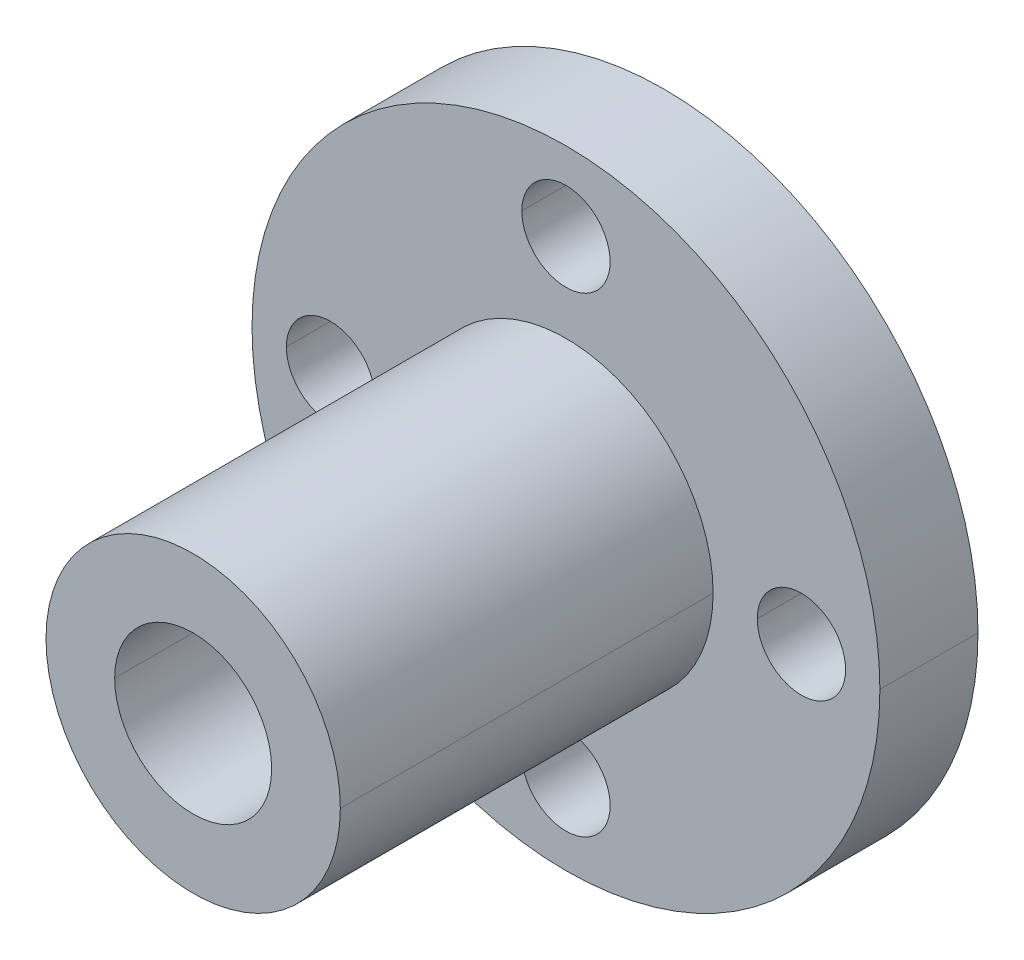
ISO-10303-21;
HEADER;
FILE_DESCRIPTION(('STEP AP214'),'2;1');
FILE_NAME('part.step','',(''),(''),'','','');
FILE_SCHEMA(('AUTOMOTIVE_DESIGN { 1 0 10303 214 1 1 1 1 }'));
ENDSEC;
DATA;
#1=APPLICATION_CONTEXT('core data for automotive mechanical design processes');
#2=APPLICATION_PROTOCOL_DEFINITION('international standard','automotive_design',2000,#1);
#3=PRODUCT_CONTEXT('',#1,'mechanical');
#4=PRODUCT('Part','Part','',(#3));
#5=PRODUCT_RELATED_PRODUCT_CATEGORY('part','',(#4));
#6=PRODUCT_DEFINITION_FORMATION('','',#4);
#7=PRODUCT_DEFINITION_CONTEXT('part definition',#1,'design');
#8=PRODUCT_DEFINITION('design','',#6,#7);
#9=PRODUCT_DEFINITION_SHAPE('','',#8);
#10=(LENGTH_UNIT() NAMED_UNIT(*) SI_UNIT(.MILLI.,.METRE.));
#11=(NAMED_UNIT(*) PLANE_ANGLE_UNIT() SI_UNIT($,.RADIAN.));
#12=(NAMED_UNIT(*) SI_UNIT($,.STERADIAN.) SOLID_ANGLE_UNIT());
#13=UNCERTAINTY_MEASURE_WITH_UNIT(LENGTH_MEASURE(1.E-05),#10,'distance_accuracy_value','');
#14=(GEOMETRIC_REPRESENTATION_CONTEXT(3) GLOBAL_UNCERTAINTY_ASSIGNED_CONTEXT((#13)) GLOBAL_UNIT_ASSIGNED_CONTEXT((#10,
#11,#12)) REPRESENTATION_CONTEXT('',''));
#15=CARTESIAN_POINT('',(0.,0.,0.));
#16=DIRECTION('',(0.,0.,1.));
#17=DIRECTION('',(1.,0.,0.));
#18=AXIS2_PLACEMENT_3D('',#15,#16,#17);
#19=CARTESIAN_POINT('',(11.9999999999992,-8.15320033709099E-13,5.));
#20=DIRECTION('',(0.,0.,-1.));
#21=DIRECTION('',(-1.,0.,0.));
#22=AXIS2_PLACEMENT_3D('',#19,#20,#21);
#23=CYLINDRICAL_SURFACE('',#22,2.25000000000115);
#24=CARTESIAN_POINT('',(11.9999999999992,-8.15320033709099E-13,5.));
#25=DIRECTION('',(0.,0.,-1.));
#26=DIRECTION('',(-1.,0.,0.));
#27=AXIS2_PLACEMENT_3D('',#24,#25,#26);
#28=CIRCLE('',#27,2.25000000000115);
#29=CARTESIAN_POINT('',(14.2500000000003,-8.15044488179291E-13,5.));
#30=VERTEX_POINT('',#29);
#31=CARTESIAN_POINT('',(9.74999999999803,-8.15320033709099E-13,5.));
#32=VERTEX_POINT('',#31);
#33=EDGE_CURVE('E42',#30,#32,#28,.T.);
#34=ORIENTED_EDGE('',*,*,#33,.F.);
#35=DIRECTION('',(0.,0.,-1.));
#36=VECTOR('',#35,1.);
#37=CARTESIAN_POINT('',(14.2500000000003,-8.15044488179291E-13,5.));
#38=LINE('',#37,#36);
#39=CARTESIAN_POINT('',(14.2500000000003,-8.15044488179291E-13,0.));
#40=VERTEX_POINT('',#39);
#41=EDGE_CURVE('E11',#30,#40,#38,.T.);
#42=ORIENTED_EDGE('',*,*,#41,.T.);
#43=CARTESIAN_POINT('',(11.9999999999992,-8.15320033709099E-13,0.));
#44=DIRECTION('',(0.,0.,-1.));
#45=DIRECTION('',(-1.,0.,0.));
#46=AXIS2_PLACEMENT_3D('',#43,#44,#45);
#47=CIRCLE('',#46,2.25000000000115);
#48=CARTESIAN_POINT('',(9.74999999999803,-8.15320033709099E-13,0.));
#49=VERTEX_POINT('',#48);
#50=EDGE_CURVE('E28',#40,#49,#47,.T.);
#51=ORIENTED_EDGE('',*,*,#50,.T.);
#52=DIRECTION('',(0.,0.,-1.));
#53=VECTOR('',#52,1.);
#54=CARTESIAN_POINT('',(9.74999999999803,-8.15320033709099E-13,5.));
#55=LINE('',#54,#53);
#56=EDGE_CURVE('E204',#32,#49,#55,.T.);
#57=ORIENTED_EDGE('',*,*,#56,.F.);
#58=EDGE_LOOP('',(#34,#42,#51,#57));
#59=FACE_BOUND('',#58,.T.);
#60=ADVANCED_FACE('F17',(#59),#23,.F.);
#61=CARTESIAN_POINT('',(-1.62650951484664E-12,-12.,5.));
#62=DIRECTION('',(0.,0.,-1.));
#63=DIRECTION('',(-1.,0.,0.));
#64=AXIS2_PLACEMENT_3D('',#61,#62,#63);
#65=CYLINDRICAL_SURFACE('',#64,2.25000000000115);
#66=CARTESIAN_POINT('',(-1.62650951484664E-12,-12.,5.));
#67=DIRECTION('',(0.,0.,-1.));
#68=DIRECTION('',(-1.,0.,0.));
#69=AXIS2_PLACEMENT_3D('',#66,#67,#68);
#70=CIRCLE('',#69,2.25000000000115);
#71=CARTESIAN_POINT('',(2.24999999999952,-12.,5.));
#72=VERTEX_POINT('',#71);
#73=CARTESIAN_POINT('',(-2.25000000000278,-12.,5.));
#74=VERTEX_POINT('',#73);
#75=EDGE_CURVE('E202',#72,#74,#70,.T.);
#76=ORIENTED_EDGE('',*,*,#75,.F.);
#77=DIRECTION('',(0.,0.,-1.));
#78=VECTOR('',#77,1.);
#79=CARTESIAN_POINT('',(2.24999999999952,-12.,5.));
#80=LINE('',#79,#78);
#81=CARTESIAN_POINT('',(2.24999999999952,-12.,0.));
#82=VERTEX_POINT('',#81);
#83=EDGE_CURVE('E212',#72,#82,#80,.T.);
#84=ORIENTED_EDGE('',*,*,#83,.T.);
#85=CARTESIAN_POINT('',(-1.62650951484664E-12,-12.,0.));
#86=DIRECTION('',(0.,0.,-1.));
#87=DIRECTION('',(-1.,0.,0.));
#88=AXIS2_PLACEMENT_3D('',#85,#86,#87);
#89=CIRCLE('',#88,2.25000000000115);
#90=CARTESIAN_POINT('',(-2.25000000000278,-12.,0.));
#91=VERTEX_POINT('',#90);
#92=EDGE_CURVE('E192',#82,#91,#89,.T.);
#93=ORIENTED_EDGE('',*,*,#92,.T.);
#94=DIRECTION('',(0.,0.,-1.));
#95=VECTOR('',#94,1.);
#96=CARTESIAN_POINT('',(-2.25000000000278,-12.,5.));
#97=LINE('',#96,#95);
#98=EDGE_CURVE('E21',#74,#91,#97,.T.);
#99=ORIENTED_EDGE('',*,*,#98,.F.);
#100=EDGE_LOOP('',(#76,#84,#93,#99));
#101=FACE_BOUND('',#100,.T.);
#102=ADVANCED_FACE('F351',(#101),#65,.F.);
#103=CARTESIAN_POINT('',(-12.0000000000008,8.13585310233123E-13,5.));
#104=DIRECTION('',(0.,0.,-1.));
#105=DIRECTION('',(-1.,0.,0.));
#106=AXIS2_PLACEMENT_3D('',#103,#104,#105);
#107=CYLINDRICAL_SURFACE('',#106,2.25000000000115);
#108=CARTESIAN_POINT('',(-12.0000000000008,8.13585310233123E-13,5.));
#109=DIRECTION('',(0.,0.,-1.));
#110=DIRECTION('',(-1.,0.,0.));
#111=AXIS2_PLACEMENT_3D('',#108,#109,#110);
#112=CIRCLE('',#111,2.25000000000115);
#113=CARTESIAN_POINT('',(-9.74999999999966,8.13860855762931E-13,5.));
#114=VERTEX_POINT('',#113);
#115=CARTESIAN_POINT('',(-14.250000000002,8.13585310233123E-13,5.));
#116=VERTEX_POINT('',#115);
#117=EDGE_CURVE('E203',#114,#116,#112,.T.);
#118=ORIENTED_EDGE('',*,*,#117,.F.);
#119=DIRECTION('',(0.,0.,-1.));
#120=VECTOR('',#119,1.);
#121=CARTESIAN_POINT('',(-9.74999999999966,8.13860855762931E-13,5.));
#122=LINE('',#121,#120);
#123=CARTESIAN_POINT('',(-9.74999999999966,8.13860855762931E-13,0.));
#124=VERTEX_POINT('',#123);
#125=EDGE_CURVE('E189',#114,#124,#122,.T.);
#126=ORIENTED_EDGE('',*,*,#125,.T.);
#127=CARTESIAN_POINT('',(-12.0000000000008,8.13585310233123E-13,0.));
#128=DIRECTION('',(0.,0.,-1.));
#129=DIRECTION('',(-1.,0.,0.));
#130=AXIS2_PLACEMENT_3D('',#127,#128,#129);
#131=CIRCLE('',#130,2.25000000000115);
#132=CARTESIAN_POINT('',(-14.250000000002,8.13585310233123E-13,0.));
#133=VERTEX_POINT('',#132);
#134=EDGE_CURVE('E193',#124,#133,#131,.T.);
#135=ORIENTED_EDGE('',*,*,#134,.T.);
#136=DIRECTION('',(0.,0.,-1.));
#137=VECTOR('',#136,1.);
#138=CARTESIAN_POINT('',(-14.250000000002,8.13585310233123E-13,5.));
#139=LINE('',#138,#137);
#140=EDGE_CURVE('E251',#116,#133,#139,.T.);
#141=ORIENTED_EDGE('',*,*,#140,.F.);
#142=EDGE_LOOP('',(#118,#126,#135,#141));
#143=FACE_BOUND('',#142,.T.);
#144=ADVANCED_FACE('F343',(#143),#107,.F.);
#145=CARTESIAN_POINT('',(0.,12.,5.));
#146=DIRECTION('',(0.,0.,-1.));
#147=DIRECTION('',(-1.,0.,0.));
#148=AXIS2_PLACEMENT_3D('',#145,#146,#147);
#149=CYLINDRICAL_SURFACE('',#148,2.25000000000115);
#150=CARTESIAN_POINT('',(0.,12.,5.));
#151=DIRECTION('',(0.,0.,-1.));
#152=DIRECTION('',(-1.,0.,0.));
#153=AXIS2_PLACEMENT_3D('',#150,#151,#152);
#154=CIRCLE('',#153,2.25000000000115);
#155=CARTESIAN_POINT('',(2.25000000000115,12.,5.));
#156=VERTEX_POINT('',#155);
#157=CARTESIAN_POINT('',(-2.25000000000115,12.,5.));
#158=VERTEX_POINT('',#157);
#159=EDGE_CURVE('E213',#156,#158,#154,.T.);
#160=ORIENTED_EDGE('',*,*,#159,.F.);
#161=DIRECTION('',(0.,0.,-1.));
#162=VECTOR('',#161,1.);
#163=CARTESIAN_POINT('',(2.25000000000115,12.,5.));
#164=LINE('',#163,#162);
#165=CARTESIAN_POINT('',(2.25000000000115,12.,0.));
#166=VERTEX_POINT('',#165);
#167=EDGE_CURVE('E243',#156,#166,#164,.T.);
#168=ORIENTED_EDGE('',*,*,#167,.T.);
#169=CARTESIAN_POINT('',(0.,12.,0.));
#170=DIRECTION('',(0.,0.,-1.));
#171=DIRECTION('',(-1.,0.,0.));
#172=AXIS2_PLACEMENT_3D('',#169,#170,#171);
#173=CIRCLE('',#172,2.25000000000115);
#174=CARTESIAN_POINT('',(-2.25000000000115,12.,0.));
#175=VERTEX_POINT('',#174);
#176=EDGE_CURVE('E235',#166,#175,#173,.T.);
#177=ORIENTED_EDGE('',*,*,#176,.T.);
#178=DIRECTION('',(0.,0.,-1.));
#179=VECTOR('',#178,1.);
#180=CARTESIAN_POINT('',(-2.25000000000115,12.,5.));
#181=LINE('',#180,#179);
#182=EDGE_CURVE('E194',#158,#175,#181,.T.);
#183=ORIENTED_EDGE('',*,*,#182,.F.);
#184=EDGE_LOOP('',(#160,#168,#177,#183));
#185=FACE_BOUND('',#184,.T.);
#186=ADVANCED_FACE('F341',(#185),#149,.F.);
#187=CARTESIAN_POINT('',(0.,0.,5.));
#188=DIRECTION('',(0.,0.,-1.));
#189=DIRECTION('',(-1.,0.,0.));
#190=AXIS2_PLACEMENT_3D('',#187,#188,#189);
#191=CYLINDRICAL_SURFACE('',#190,16.);
#192=CARTESIAN_POINT('',(0.,0.,5.));
#193=DIRECTION('',(0.,0.,-1.));
#194=DIRECTION('',(-1.,0.,0.));
#195=AXIS2_PLACEMENT_3D('',#192,#193,#194);
#196=CIRCLE('',#195,16.);
#197=CARTESIAN_POINT('',(-16.,0.,5.));
#198=VERTEX_POINT('',#197);
#199=CARTESIAN_POINT('',(16.,0.,5.));
#200=VERTEX_POINT('',#199);
#201=EDGE_CURVE('E231',#198,#200,#196,.T.);
#202=ORIENTED_EDGE('',*,*,#201,.T.);
#203=DIRECTION('',(0.,0.,-1.));
#204=VECTOR('',#203,1.);
#205=CARTESIAN_POINT('',(16.,0.,5.));
#206=LINE('',#205,#204);
#207=CARTESIAN_POINT('',(16.,0.,0.));
#208=VERTEX_POINT('',#207);
#209=EDGE_CURVE('E236',#200,#208,#206,.T.);
#210=ORIENTED_EDGE('',*,*,#209,.T.);
#211=CARTESIAN_POINT('',(0.,0.,0.));
#212=DIRECTION('',(0.,0.,-1.));
#213=DIRECTION('',(-1.,0.,0.));
#214=AXIS2_PLACEMENT_3D('',#211,#212,#213);
#215=CIRCLE('',#214,16.);
#216=CARTESIAN_POINT('',(-16.,0.,0.));
#217=VERTEX_POINT('',#216);
#218=EDGE_CURVE('E167',#217,#208,#215,.T.);
#219=ORIENTED_EDGE('',*,*,#218,.F.);
#220=DIRECTION('',(0.,0.,-1.));
#221=VECTOR('',#220,1.);
#222=CARTESIAN_POINT('',(-16.,0.,5.));
#223=LINE('',#222,#221);
#224=EDGE_CURVE('E256',#198,#217,#223,.T.);
#225=ORIENTED_EDGE('',*,*,#224,.F.);
#226=EDGE_LOOP('',(#202,#210,#219,#225));
#227=FACE_BOUND('',#226,.T.);
#228=ADVANCED_FACE('F317',(#227),#191,.T.);
#229=CARTESIAN_POINT('',(0.,0.,24.));
#230=DIRECTION('',(0.,0.,-1.));
#231=DIRECTION('',(-1.,0.,0.));
#232=AXIS2_PLACEMENT_3D('',#229,#230,#231);
#233=CYLINDRICAL_SURFACE('',#232,4.);
#234=CARTESIAN_POINT('',(0.,0.,24.));
#235=DIRECTION('',(0.,0.,1.));
#236=DIRECTION('',(1.,0.,0.));
#237=AXIS2_PLACEMENT_3D('',#234,#235,#236);
#238=CIRCLE('',#237,4.);
#239=CARTESIAN_POINT('',(-4.,0.,24.));
#240=VERTEX_POINT('',#239);
#241=CARTESIAN_POINT('',(4.,0.,24.));
#242=VERTEX_POINT('',#241);
#243=EDGE_CURVE('E301',#240,#242,#238,.T.);
#244=ORIENTED_EDGE('',*,*,#243,.T.);
#245=DIRECTION('',(0.,0.,-1.));
#246=VECTOR('',#245,1.);
#247=CARTESIAN_POINT('',(4.,0.,24.));
#248=LINE('',#247,#246);
#249=CARTESIAN_POINT('',(4.,0.,0.));
#250=VERTEX_POINT('',#249);
#251=EDGE_CURVE('E174',#242,#250,#248,.T.);
#252=ORIENTED_EDGE('',*,*,#251,.T.);
#253=CARTESIAN_POINT('',(0.,0.,0.));
#254=DIRECTION('',(0.,0.,1.));
#255=DIRECTION('',(1.,0.,0.));
#256=AXIS2_PLACEMENT_3D('',#253,#254,#255);
#257=CIRCLE('',#256,4.);
#258=CARTESIAN_POINT('',(-4.,0.,0.));
#259=VERTEX_POINT('',#258);
#260=EDGE_CURVE('E230',#259,#250,#257,.T.);
#261=ORIENTED_EDGE('',*,*,#260,.F.);
#262=DIRECTION('',(0.,0.,-1.));
#263=VECTOR('',#262,1.);
#264=CARTESIAN_POINT('',(-4.,0.,24.));
#265=LINE('',#264,#263);
#266=EDGE_CURVE('E146',#240,#259,#265,.T.);
#267=ORIENTED_EDGE('',*,*,#266,.F.);
#268=EDGE_LOOP('',(#244,#252,#261,#267));
#269=FACE_BOUND('',#268,.T.);
#270=ADVANCED_FACE('F350',(#269),#233,.F.);
#271=CARTESIAN_POINT('',(0.,0.,24.));
#272=DIRECTION('',(0.,0.,-1.));
#273=DIRECTION('',(-1.,0.,0.));
#274=AXIS2_PLACEMENT_3D('',#271,#272,#273);
#275=CYLINDRICAL_SURFACE('',#274,7.5);
#276=CARTESIAN_POINT('',(0.,0.,24.));
#277=DIRECTION('',(0.,0.,1.));
#278=DIRECTION('',(1.,0.,0.));
#279=AXIS2_PLACEMENT_3D('',#276,#277,#278);
#280=CIRCLE('',#279,7.5);
#281=CARTESIAN_POINT('',(7.5,0.,24.));
#282=VERTEX_POINT('',#281);
#283=CARTESIAN_POINT('',(-7.5,0.,24.));
#284=VERTEX_POINT('',#283);
#285=EDGE_CURVE('E155',#282,#284,#280,.T.);
#286=ORIENTED_EDGE('',*,*,#285,.F.);
#287=DIRECTION('',(0.,0.,-1.));
#288=VECTOR('',#287,1.);
#289=CARTESIAN_POINT('',(7.5,0.,24.));
#290=LINE('',#289,#288);
#291=CARTESIAN_POINT('',(7.5,0.,5.));
#292=VERTEX_POINT('',#291);
#293=EDGE_CURVE('E158',#282,#292,#290,.T.);
#294=ORIENTED_EDGE('',*,*,#293,.T.);
#295=CARTESIAN_POINT('',(0.,0.,5.));
#296=DIRECTION('',(0.,0.,-1.));
#297=DIRECTION('',(-1.,0.,0.));
#298=AXIS2_PLACEMENT_3D('',#295,#296,#297);
#299=CIRCLE('',#298,7.5);
#300=CARTESIAN_POINT('',(-7.5,0.,5.));
#301=VERTEX_POINT('',#300);
#302=EDGE_CURVE('E218',#301,#292,#299,.T.);
#303=ORIENTED_EDGE('',*,*,#302,.F.);
#304=DIRECTION('',(0.,0.,-1.));
#305=VECTOR('',#304,1.);
#306=CARTESIAN_POINT('',(-7.5,0.,24.));
#307=LINE('',#306,#305);
#308=EDGE_CURVE('E161',#284,#301,#307,.T.);
#309=ORIENTED_EDGE('',*,*,#308,.F.);
#310=EDGE_LOOP('',(#286,#294,#303,#309));
#311=FACE_BOUND('',#310,.T.);
#312=ADVANCED_FACE('F157',(#311),#275,.T.);
#313=CARTESIAN_POINT('',(0.,0.,24.));
#314=DIRECTION('',(0.,0.,-1.));
#315=DIRECTION('',(-1.,0.,0.));
#316=AXIS2_PLACEMENT_3D('',#313,#314,#315);
#317=CYLINDRICAL_SURFACE('',#316,7.5);
#318=ORIENTED_EDGE('',*,*,#293,.F.);
#319=CARTESIAN_POINT('',(0.,0.,24.));
#320=DIRECTION('',(0.,0.,1.));
#321=DIRECTION('',(1.,0.,0.));
#322=AXIS2_PLACEMENT_3D('',#319,#320,#321);
#323=CIRCLE('',#322,7.5);
#324=EDGE_CURVE('E166',#284,#282,#323,.T.);
#325=ORIENTED_EDGE('',*,*,#324,.F.);
#326=ORIENTED_EDGE('',*,*,#308,.T.);
#327=CARTESIAN_POINT('',(0.,0.,5.));
#328=DIRECTION('',(0.,0.,-1.));
#329=DIRECTION('',(-1.,0.,0.));
#330=AXIS2_PLACEMENT_3D('',#327,#328,#329);
#331=CIRCLE('',#330,7.5);
#332=EDGE_CURVE('E172',#292,#301,#331,.T.);
#333=ORIENTED_EDGE('',*,*,#332,.F.);
#334=EDGE_LOOP('',(#318,#325,#326,#333));
#335=FACE_BOUND('',#334,.T.);
#336=ADVANCED_FACE('F170',(#335),#317,.T.);
#337=CARTESIAN_POINT('',(0.,0.,24.));
#338=DIRECTION('',(0.,0.,1.));
#339=DIRECTION('',(1.,0.,0.));
#340=AXIS2_PLACEMENT_3D('',#337,#338,#339);
#341=PLANE('',#340);
#342=ORIENTED_EDGE('',*,*,#324,.T.);
#343=ORIENTED_EDGE('',*,*,#285,.T.);
#344=EDGE_LOOP('',(#342,#343));
#345=FACE_BOUND('',#344,.T.);
#346=ORIENTED_EDGE('',*,*,#243,.F.);
#347=CARTESIAN_POINT('',(0.,0.,24.));
#348=DIRECTION('',(0.,0.,1.));
#349=DIRECTION('',(1.,0.,0.));
#350=AXIS2_PLACEMENT_3D('',#347,#348,#349);
#351=CIRCLE('',#350,4.);
#352=EDGE_CURVE('E224',#242,#240,#351,.T.);
#353=ORIENTED_EDGE('',*,*,#352,.F.);
#354=EDGE_LOOP('',(#346,#353));
#355=FACE_BOUND('',#354,.T.);
#356=ADVANCED_FACE('F176',(#345,#355),#341,.T.);
#357=CARTESIAN_POINT('',(0.,0.,0.));
#358=DIRECTION('',(0.,0.,1.));
#359=DIRECTION('',(1.,0.,0.));
#360=AXIS2_PLACEMENT_3D('',#357,#358,#359);
#361=PLANE('',#360);
#362=ORIENTED_EDGE('',*,*,#218,.T.);
#363=CARTESIAN_POINT('',(0.,0.,0.));
#364=DIRECTION('',(0.,0.,-1.));
#365=DIRECTION('',(-1.,0.,0.));
#366=AXIS2_PLACEMENT_3D('',#363,#364,#365);
#367=CIRCLE('',#366,16.);
#368=EDGE_CURVE('E226',#208,#217,#367,.T.);
#369=ORIENTED_EDGE('',*,*,#368,.T.);
#370=EDGE_LOOP('',(#362,#369));
#371=FACE_BOUND('',#370,.T.);
#372=ORIENTED_EDGE('',*,*,#260,.T.);
#373=CARTESIAN_POINT('',(0.,0.,0.));
#374=DIRECTION('',(0.,0.,1.));
#375=DIRECTION('',(1.,0.,0.));
#376=AXIS2_PLACEMENT_3D('',#373,#374,#375);
#377=CIRCLE('',#376,4.);
#378=EDGE_CURVE('E246',#250,#259,#377,.T.);
#379=ORIENTED_EDGE('',*,*,#378,.T.);
#380=EDGE_LOOP('',(#372,#379));
#381=FACE_BOUND('',#380,.T.);
#382=CARTESIAN_POINT('',(11.9999999999992,-8.15320033709099E-13,0.));
#383=DIRECTION('',(0.,0.,-1.));
#384=DIRECTION('',(-1.,0.,0.));
#385=AXIS2_PLACEMENT_3D('',#382,#383,#384);
#386=CIRCLE('',#385,2.25000000000115);
#387=EDGE_CURVE('E208',#49,#40,#386,.T.);
#388=ORIENTED_EDGE('',*,*,#387,.F.);
#389=ORIENTED_EDGE('',*,*,#50,.F.);
#390=EDGE_LOOP('',(#388,#389));
#391=FACE_BOUND('',#390,.T.);
#392=CARTESIAN_POINT('',(-1.62650951484664E-12,-12.,0.));
#393=DIRECTION('',(0.,0.,-1.));
#394=DIRECTION('',(-1.,0.,0.));
#395=AXIS2_PLACEMENT_3D('',#392,#393,#394);
#396=CIRCLE('',#395,2.25000000000115);
#397=EDGE_CURVE('E207',#91,#82,#396,.T.);
#398=ORIENTED_EDGE('',*,*,#397,.F.);
#399=ORIENTED_EDGE('',*,*,#92,.F.);
#400=EDGE_LOOP('',(#398,#399));
#401=FACE_BOUND('',#400,.T.);
#402=CARTESIAN_POINT('',(-12.0000000000008,8.13585310233123E-13,0.));
#403=DIRECTION('',(0.,0.,-1.));
#404=DIRECTION('',(-1.,0.,0.));
#405=AXIS2_PLACEMENT_3D('',#402,#403,#404);
#406=CIRCLE('',#405,2.25000000000115);
#407=EDGE_CURVE('E247',#133,#124,#406,.T.);
#408=ORIENTED_EDGE('',*,*,#407,.F.);
#409=ORIENTED_EDGE('',*,*,#134,.F.);
#410=EDGE_LOOP('',(#408,#409));
#411=FACE_BOUND('',#410,.T.);
#412=CARTESIAN_POINT('',(0.,12.,0.));
#413=DIRECTION('',(0.,0.,-1.));
#414=DIRECTION('',(-1.,0.,0.));
#415=AXIS2_PLACEMENT_3D('',#412,#413,#414);
#416=CIRCLE('',#415,2.25000000000115);
#417=EDGE_CURVE('E197',#175,#166,#416,.T.);
#418=ORIENTED_EDGE('',*,*,#417,.F.);
#419=ORIENTED_EDGE('',*,*,#176,.F.);
#420=EDGE_LOOP('',(#418,#419));
#421=FACE_BOUND('',#420,.T.);
#422=ADVANCED_FACE('F324',(#371,#381,#391,#401,#411,#421),#361,.F.);
#423=CARTESIAN_POINT('',(0.,0.,24.));
#424=DIRECTION('',(0.,0.,-1.));
#425=DIRECTION('',(-1.,0.,0.));
#426=AXIS2_PLACEMENT_3D('',#423,#424,#425);
#427=CYLINDRICAL_SURFACE('',#426,4.);
#428=ORIENTED_EDGE('',*,*,#251,.F.);
#429=ORIENTED_EDGE('',*,*,#352,.T.);
#430=ORIENTED_EDGE('',*,*,#266,.T.);
#431=ORIENTED_EDGE('',*,*,#378,.F.);
#432=EDGE_LOOP('',(#428,#429,#430,#431));
#433=FACE_BOUND('',#432,.T.);
#434=ADVANCED_FACE('F327',(#433),#427,.F.);
#435=CARTESIAN_POINT('',(0.,0.,5.));
#436=DIRECTION('',(0.,0.,-1.));
#437=DIRECTION('',(-1.,0.,0.));
#438=AXIS2_PLACEMENT_3D('',#435,#436,#437);
#439=CYLINDRICAL_SURFACE('',#438,16.);
#440=ORIENTED_EDGE('',*,*,#209,.F.);
#441=CARTESIAN_POINT('',(0.,0.,5.));
#442=DIRECTION('',(0.,0.,-1.));
#443=DIRECTION('',(-1.,0.,0.));
#444=AXIS2_PLACEMENT_3D('',#441,#442,#443);
#445=CIRCLE('',#444,16.);
#446=EDGE_CURVE('E225',#200,#198,#445,.T.);
#447=ORIENTED_EDGE('',*,*,#446,.T.);
#448=ORIENTED_EDGE('',*,*,#224,.T.);
#449=ORIENTED_EDGE('',*,*,#368,.F.);
#450=EDGE_LOOP('',(#440,#447,#448,#449));
#451=FACE_BOUND('',#450,.T.);
#452=ADVANCED_FACE('F322',(#451),#439,.T.);
#453=CARTESIAN_POINT('',(0.,0.,5.));
#454=DIRECTION('',(0.,0.,-1.));
#455=DIRECTION('',(0.,-1.,0.));
#456=AXIS2_PLACEMENT_3D('',#453,#454,#455);
#457=PLANE('',#456);
#458=ORIENTED_EDGE('',*,*,#201,.F.);
#459=ORIENTED_EDGE('',*,*,#446,.F.);
#460=EDGE_LOOP('',(#458,#459));
#461=FACE_BOUND('',#460,.T.);
#462=CARTESIAN_POINT('',(11.9999999999992,-8.15320033709099E-13,5.));
#463=DIRECTION('',(0.,0.,-1.));
#464=DIRECTION('',(-1.,0.,0.));
#465=AXIS2_PLACEMENT_3D('',#462,#463,#464);
#466=CIRCLE('',#465,2.25000000000115);
#467=EDGE_CURVE('E252',#32,#30,#466,.T.);
#468=ORIENTED_EDGE('',*,*,#467,.T.);
#469=ORIENTED_EDGE('',*,*,#33,.T.);
#470=EDGE_LOOP('',(#468,#469));
#471=FACE_BOUND('',#470,.T.);
#472=CARTESIAN_POINT('',(-1.62650951484664E-12,-12.,5.));
#473=DIRECTION('',(0.,0.,-1.));
#474=DIRECTION('',(-1.,0.,0.));
#475=AXIS2_PLACEMENT_3D('',#472,#473,#474);
#476=CIRCLE('',#475,2.25000000000115);
#477=EDGE_CURVE('E261',#74,#72,#476,.T.);
#478=ORIENTED_EDGE('',*,*,#477,.T.);
#479=ORIENTED_EDGE('',*,*,#75,.T.);
#480=EDGE_LOOP('',(#478,#479));
#481=FACE_BOUND('',#480,.T.);
#482=CARTESIAN_POINT('',(-12.0000000000008,8.13585310233123E-13,5.));
#483=DIRECTION('',(0.,0.,-1.));
#484=DIRECTION('',(-1.,0.,0.));
#485=AXIS2_PLACEMENT_3D('',#482,#483,#484);
#486=CIRCLE('',#485,2.25000000000115);
#487=EDGE_CURVE('E198',#116,#114,#486,.T.);
#488=ORIENTED_EDGE('',*,*,#487,.T.);
#489=ORIENTED_EDGE('',*,*,#117,.T.);
#490=EDGE_LOOP('',(#488,#489));
#491=FACE_BOUND('',#490,.T.);
#492=CARTESIAN_POINT('',(0.,12.,5.));
#493=DIRECTION('',(0.,0.,-1.));
#494=DIRECTION('',(-1.,0.,0.));
#495=AXIS2_PLACEMENT_3D('',#492,#493,#494);
#496=CIRCLE('',#495,2.25000000000115);
#497=EDGE_CURVE('E217',#158,#156,#496,.T.);
#498=ORIENTED_EDGE('',*,*,#497,.T.);
#499=ORIENTED_EDGE('',*,*,#159,.T.);
#500=EDGE_LOOP('',(#498,#499));
#501=FACE_BOUND('',#500,.T.);
#502=ORIENTED_EDGE('',*,*,#302,.T.);
#503=ORIENTED_EDGE('',*,*,#332,.T.);
#504=EDGE_LOOP('',(#502,#503));
#505=FACE_BOUND('',#504,.T.);
#506=ADVANCED_FACE('F367',(#461,#471,#481,#491,#501,#505),#457,.F.);
#507=CARTESIAN_POINT('',(0.,12.,5.));
#508=DIRECTION('',(0.,0.,-1.));
#509=DIRECTION('',(-1.,0.,0.));
#510=AXIS2_PLACEMENT_3D('',#507,#508,#509);
#511=CYLINDRICAL_SURFACE('',#510,2.25000000000115);
#512=ORIENTED_EDGE('',*,*,#167,.F.);
#513=ORIENTED_EDGE('',*,*,#497,.F.);
#514=ORIENTED_EDGE('',*,*,#182,.T.);
#515=ORIENTED_EDGE('',*,*,#417,.T.);
#516=EDGE_LOOP('',(#512,#513,#514,#515));
#517=FACE_BOUND('',#516,.T.);
#518=ADVANCED_FACE('F338',(#517),#511,.F.);
#519=CARTESIAN_POINT('',(-12.0000000000008,8.13585310233123E-13,5.));
#520=DIRECTION('',(0.,0.,-1.));
#521=DIRECTION('',(-1.,0.,0.));
#522=AXIS2_PLACEMENT_3D('',#519,#520,#521);
#523=CYLINDRICAL_SURFACE('',#522,2.25000000000115);
#524=ORIENTED_EDGE('',*,*,#125,.F.);
#525=ORIENTED_EDGE('',*,*,#487,.F.);
#526=ORIENTED_EDGE('',*,*,#140,.T.);
#527=ORIENTED_EDGE('',*,*,#407,.T.);
#528=EDGE_LOOP('',(#524,#525,#526,#527));
#529=FACE_BOUND('',#528,.T.);
#530=ADVANCED_FACE('F19',(#529),#523,.F.);
#531=CARTESIAN_POINT('',(-1.62650951484664E-12,-12.,5.));
#532=DIRECTION('',(0.,0.,-1.));
#533=DIRECTION('',(-1.,0.,0.));
#534=AXIS2_PLACEMENT_3D('',#531,#532,#533);
#535=CYLINDRICAL_SURFACE('',#534,2.25000000000115);
#536=ORIENTED_EDGE('',*,*,#83,.F.);
#537=ORIENTED_EDGE('',*,*,#477,.F.);
#538=ORIENTED_EDGE('',*,*,#98,.T.);
#539=ORIENTED_EDGE('',*,*,#397,.T.);
#540=EDGE_LOOP('',(#536,#537,#538,#539));
#541=FACE_BOUND('',#540,.T.);
#542=ADVANCED_FACE('F524',(#541),#535,.F.);
#543=CARTESIAN_POINT('',(11.9999999999992,-8.15320033709099E-13,5.));
#544=DIRECTION('',(0.,0.,-1.));
#545=DIRECTION('',(-1.,0.,0.));
#546=AXIS2_PLACEMENT_3D('',#543,#544,#545);
#547=CYLINDRICAL_SURFACE('',#546,2.25000000000115);
#548=ORIENTED_EDGE('',*,*,#41,.F.);
#549=ORIENTED_EDGE('',*,*,#467,.F.);
#550=ORIENTED_EDGE('',*,*,#56,.T.);
#551=ORIENTED_EDGE('',*,*,#387,.T.);
#552=EDGE_LOOP('',(#548,#549,#550,#551));
#553=FACE_BOUND('',#552,.T.);
#554=ADVANCED_FACE('F520',(#553),#547,.F.);
#555=CLOSED_SHELL('',(#60,#102,#144,#186,#228,#270,#312,#336,#356,#422,#434,#452,#506,#518,#530,
#542,#554));
#556=MANIFOLD_SOLID_BREP('B1',#555);
#557=ADVANCED_BREP_SHAPE_REPRESENTATION('',(#18,#556),#14);
#558=SHAPE_DEFINITION_REPRESENTATION(#9,#557);
ENDSEC;
END-ISO-10303-21;
